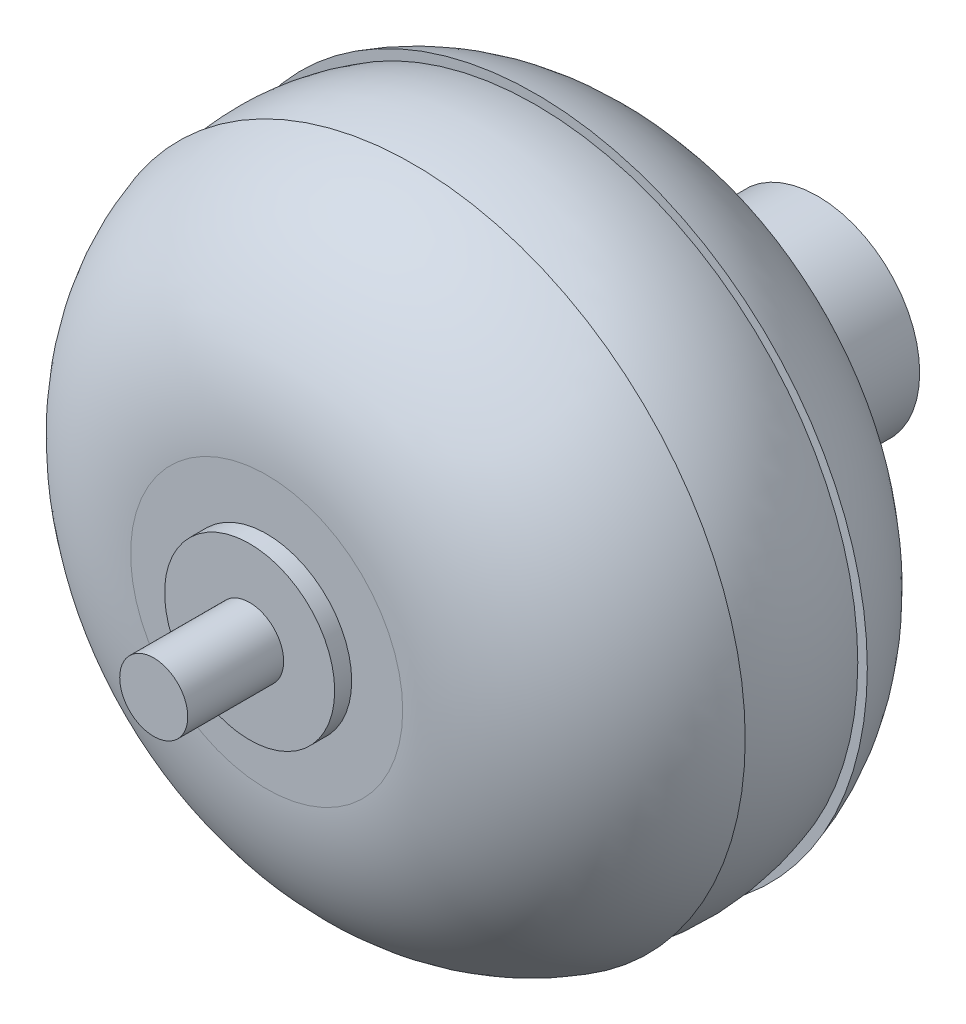
ISO-10303-21;
HEADER;
FILE_DESCRIPTION(('STEP AP214'),'2;1');
FILE_NAME('part.step','',(''),(''),'','','');
FILE_SCHEMA(('AUTOMOTIVE_DESIGN { 1 0 10303 214 1 1 1 1 }'));
ENDSEC;
DATA;
#1=APPLICATION_CONTEXT('core data for automotive mechanical design processes');
#2=APPLICATION_PROTOCOL_DEFINITION('international standard','automotive_design',2000,#1);
#3=PRODUCT_CONTEXT('',#1,'mechanical');
#4=PRODUCT('Part','Part','',(#3));
#5=PRODUCT_RELATED_PRODUCT_CATEGORY('part','',(#4));
#6=PRODUCT_DEFINITION_FORMATION('','',#4);
#7=PRODUCT_DEFINITION_CONTEXT('part definition',#1,'design');
#8=PRODUCT_DEFINITION('design','',#6,#7);
#9=PRODUCT_DEFINITION_SHAPE('','',#8);
#10=(LENGTH_UNIT() NAMED_UNIT(*) SI_UNIT(.MILLI.,.METRE.));
#11=(NAMED_UNIT(*) PLANE_ANGLE_UNIT() SI_UNIT($,.RADIAN.));
#12=(NAMED_UNIT(*) SI_UNIT($,.STERADIAN.) SOLID_ANGLE_UNIT());
#13=UNCERTAINTY_MEASURE_WITH_UNIT(LENGTH_MEASURE(1.E-05),#10,'distance_accuracy_value','');
#14=(GEOMETRIC_REPRESENTATION_CONTEXT(3) GLOBAL_UNCERTAINTY_ASSIGNED_CONTEXT((#13)) GLOBAL_UNIT_ASSIGNED_CONTEXT((#10,
#11,#12)) REPRESENTATION_CONTEXT('',''));
#15=CARTESIAN_POINT('',(0.,0.,0.));
#16=DIRECTION('',(0.,0.,1.));
#17=DIRECTION('',(1.,0.,0.));
#18=AXIS2_PLACEMENT_3D('',#15,#16,#17);
#19=CARTESIAN_POINT('',(0.,0.,6.2));
#20=DIRECTION('',(0.,0.,1.));
#21=DIRECTION('',(1.,0.,0.));
#22=AXIS2_PLACEMENT_3D('',#19,#20,#21);
#23=DEGENERATE_TOROIDAL_SURFACE('',#22,4.,6.,.T.);
#24=CARTESIAN_POINT('',(0.,0.,12.2));
#25=DIRECTION('',(0.,0.,1.));
#26=DIRECTION('',(1.,0.,0.));
#27=AXIS2_PLACEMENT_3D('',#24,#25,#26);
#28=CIRCLE('',#27,4.);
#29=CARTESIAN_POINT('',(4.,0.,12.2));
#30=VERTEX_POINT('',#29);
#31=EDGE_CURVE('E55',#30,#30,#28,.T.);
#32=ORIENTED_EDGE('',*,*,#31,.F.);
#33=EDGE_LOOP('',(#32));
#34=FACE_BOUND('',#33,.T.);
#35=CARTESIAN_POINT('',(0.,0.,7.88726295495752));
#36=DIRECTION('',(0.,0.,-1.));
#37=DIRECTION('',(-1.,0.,0.));
#38=AXIS2_PLACEMENT_3D('',#35,#36,#37);
#39=CIRCLE('',#38,9.75787666773334);
#40=CARTESIAN_POINT('',(-9.75787666773334,0.,7.88726295495752));
#41=VERTEX_POINT('',#40);
#42=EDGE_CURVE('E43',#41,#41,#39,.F.);
#43=ORIENTED_EDGE('',*,*,#42,.T.);
#44=EDGE_LOOP('',(#43));
#45=FACE_BOUND('',#44,.T.);
#46=ADVANCED_FACE('F39',(#34,#45),#23,.T.);
#47=CARTESIAN_POINT('',(0.,0.,12.2));
#48=DIRECTION('',(0.,0.,1.));
#49=DIRECTION('',(1.,0.,0.));
#50=AXIS2_PLACEMENT_3D('',#47,#48,#49);
#51=PLANE('',#50);
#52=ORIENTED_EDGE('',*,*,#31,.T.);
#53=EDGE_LOOP('',(#52));
#54=FACE_BOUND('',#53,.T.);
#55=CARTESIAN_POINT('',(0.,0.,12.2));
#56=DIRECTION('',(0.,0.,1.));
#57=DIRECTION('',(1.,0.,0.));
#58=AXIS2_PLACEMENT_3D('',#55,#56,#57);
#59=CIRCLE('',#58,2.5);
#60=CARTESIAN_POINT('',(2.5,0.,12.2));
#61=VERTEX_POINT('',#60);
#62=EDGE_CURVE('E96',#61,#61,#59,.T.);
#63=ORIENTED_EDGE('',*,*,#62,.F.);
#64=EDGE_LOOP('',(#63));
#65=FACE_BOUND('',#64,.T.);
#66=ADVANCED_FACE('F106',(#54,#65),#51,.T.);
#67=CARTESIAN_POINT('',(0.,0.,12.7));
#68=DIRECTION('',(0.,0.,-1.));
#69=DIRECTION('',(-1.,0.,0.));
#70=AXIS2_PLACEMENT_3D('',#67,#68,#69);
#71=CYLINDRICAL_SURFACE('',#70,2.5);
#72=CARTESIAN_POINT('',(0.,0.,12.7));
#73=DIRECTION('',(0.,0.,1.));
#74=DIRECTION('',(1.,0.,0.));
#75=AXIS2_PLACEMENT_3D('',#72,#73,#74);
#76=CIRCLE('',#75,2.5);
#77=CARTESIAN_POINT('',(2.5,0.,12.7));
#78=VERTEX_POINT('',#77);
#79=EDGE_CURVE('E93',#78,#78,#76,.T.);
#80=ORIENTED_EDGE('',*,*,#79,.F.);
#81=EDGE_LOOP('',(#80));
#82=FACE_BOUND('',#81,.T.);
#83=ORIENTED_EDGE('',*,*,#62,.T.);
#84=EDGE_LOOP('',(#83));
#85=FACE_BOUND('',#84,.T.);
#86=ADVANCED_FACE('F157',(#82,#85),#71,.T.);
#87=CARTESIAN_POINT('',(0.,0.,12.7));
#88=DIRECTION('',(0.,0.,1.));
#89=DIRECTION('',(1.,0.,0.));
#90=AXIS2_PLACEMENT_3D('',#87,#88,#89);
#91=PLANE('',#90);
#92=CARTESIAN_POINT('',(0.,0.,12.7));
#93=DIRECTION('',(0.,0.,1.));
#94=DIRECTION('',(1.,0.,0.));
#95=AXIS2_PLACEMENT_3D('',#92,#93,#94);
#96=CIRCLE('',#95,1.);
#97=CARTESIAN_POINT('',(-1.,0.,12.7));
#98=VERTEX_POINT('',#97);
#99=EDGE_CURVE('E92',#98,#98,#96,.F.);
#100=ORIENTED_EDGE('',*,*,#99,.T.);
#101=EDGE_LOOP('',(#100));
#102=FACE_BOUND('',#101,.T.);
#103=ORIENTED_EDGE('',*,*,#79,.T.);
#104=EDGE_LOOP('',(#103));
#105=FACE_BOUND('',#104,.T.);
#106=ADVANCED_FACE('F153',(#102,#105),#91,.T.);
#107=CARTESIAN_POINT('',(0.,0.,15.52));
#108=DIRECTION('',(0.,0.,-1.));
#109=DIRECTION('',(-1.,0.,0.));
#110=AXIS2_PLACEMENT_3D('',#107,#108,#109);
#111=CYLINDRICAL_SURFACE('',#110,1.);
#112=CARTESIAN_POINT('',(0.,0.,15.52));
#113=DIRECTION('',(0.,0.,1.));
#114=DIRECTION('',(1.,0.,0.));
#115=AXIS2_PLACEMENT_3D('',#112,#113,#114);
#116=CIRCLE('',#115,1.);
#117=CARTESIAN_POINT('',(-1.,0.,15.52));
#118=VERTEX_POINT('',#117);
#119=EDGE_CURVE('E89',#118,#118,#116,.T.);
#120=CARTESIAN_POINT('',(-1.,0.,12.7));
#121=CARTESIAN_POINT('',(-1.,0.,12.729375));
#122=CARTESIAN_POINT('',(-1.,0.,12.75875));
#123=CARTESIAN_POINT('',(-1.,0.,12.8175));
#124=CARTESIAN_POINT('',(-1.,0.,12.846875));
#125=CARTESIAN_POINT('',(-1.,0.,12.905625));
#126=CARTESIAN_POINT('',(-1.,0.,12.935));
#127=CARTESIAN_POINT('',(-1.,0.,12.99375));
#128=CARTESIAN_POINT('',(-1.,0.,13.023125));
#129=CARTESIAN_POINT('',(-1.,0.,13.081875));
#130=CARTESIAN_POINT('',(-1.,0.,13.11125));
#131=CARTESIAN_POINT('',(-1.,0.,13.17));
#132=CARTESIAN_POINT('',(-1.,0.,13.199375));
#133=CARTESIAN_POINT('',(-1.,0.,13.258125));
#134=CARTESIAN_POINT('',(-1.,0.,13.2875));
#135=CARTESIAN_POINT('',(-1.,0.,13.34625));
#136=CARTESIAN_POINT('',(-1.,0.,13.375625));
#137=CARTESIAN_POINT('',(-1.,0.,13.434375));
#138=CARTESIAN_POINT('',(-1.,0.,13.46375));
#139=CARTESIAN_POINT('',(-1.,0.,13.5225));
#140=CARTESIAN_POINT('',(-1.,0.,13.551875));
#141=CARTESIAN_POINT('',(-1.,0.,13.610625));
#142=CARTESIAN_POINT('',(-1.,0.,13.64));
#143=CARTESIAN_POINT('',(-1.,0.,13.69875));
#144=CARTESIAN_POINT('',(-1.,0.,13.728125));
#145=CARTESIAN_POINT('',(-1.,0.,13.786875));
#146=CARTESIAN_POINT('',(-1.,0.,13.81625));
#147=CARTESIAN_POINT('',(-1.,0.,13.875));
#148=CARTESIAN_POINT('',(-1.,0.,13.904375));
#149=CARTESIAN_POINT('',(-1.,0.,13.963125));
#150=CARTESIAN_POINT('',(-1.,0.,13.9925));
#151=CARTESIAN_POINT('',(-1.,0.,14.05125));
#152=CARTESIAN_POINT('',(-1.,0.,14.080625));
#153=CARTESIAN_POINT('',(-1.,0.,14.139375));
#154=CARTESIAN_POINT('',(-1.,0.,14.16875));
#155=CARTESIAN_POINT('',(-1.,0.,14.2275));
#156=CARTESIAN_POINT('',(-1.,0.,14.256875));
#157=CARTESIAN_POINT('',(-1.,0.,14.315625));
#158=CARTESIAN_POINT('',(-1.,0.,14.345));
#159=CARTESIAN_POINT('',(-1.,0.,14.40375));
#160=CARTESIAN_POINT('',(-1.,0.,14.433125));
#161=CARTESIAN_POINT('',(-1.,0.,14.491875));
#162=CARTESIAN_POINT('',(-1.,0.,14.52125));
#163=CARTESIAN_POINT('',(-1.,0.,14.58));
#164=CARTESIAN_POINT('',(-1.,0.,14.609375));
#165=CARTESIAN_POINT('',(-1.,0.,14.668125));
#166=CARTESIAN_POINT('',(-1.,0.,14.6975));
#167=CARTESIAN_POINT('',(-1.,0.,14.75625));
#168=CARTESIAN_POINT('',(-1.,0.,14.785625));
#169=CARTESIAN_POINT('',(-1.,0.,14.844375));
#170=CARTESIAN_POINT('',(-1.,0.,14.87375));
#171=CARTESIAN_POINT('',(-1.,0.,14.9325));
#172=CARTESIAN_POINT('',(-1.,0.,14.961875));
#173=CARTESIAN_POINT('',(-1.,0.,15.020625));
#174=CARTESIAN_POINT('',(-1.,0.,15.05));
#175=CARTESIAN_POINT('',(-1.,0.,15.10875));
#176=CARTESIAN_POINT('',(-1.,0.,15.138125));
#177=CARTESIAN_POINT('',(-1.,0.,15.196875));
#178=CARTESIAN_POINT('',(-1.,0.,15.22625));
#179=CARTESIAN_POINT('',(-1.,0.,15.285));
#180=CARTESIAN_POINT('',(-1.,0.,15.314375));
#181=CARTESIAN_POINT('',(-1.,0.,15.373125));
#182=CARTESIAN_POINT('',(-1.,0.,15.4025));
#183=CARTESIAN_POINT('',(-1.,0.,15.46125));
#184=CARTESIAN_POINT('',(-1.,0.,15.490625));
#185=CARTESIAN_POINT('',(-1.,0.,15.52));
#186=B_SPLINE_CURVE_WITH_KNOTS('',3,(#120,#121,#122,#123,#124,#125,#126,#127,#128,#129,#130,
#131,#132,#133,#134,#135,#136,#137,#138,#139,#140,#141,#142,#143,#144,#145,#146,#147,#148,#149,
#150,#151,#152,#153,#154,#155,#156,#157,#158,#159,#160,#161,#162,#163,#164,#165,#166,#167,#168,
#169,#170,#171,#172,#173,#174,#175,#176,#177,#178,#179,#180,#181,#182,#183,#184,#185),
.UNSPECIFIED.,.F.,.F.,(4,2,2,2,2,2,2,2,2,2,2,2,2,2,2,2,2,2,2,2,2,2,2,2,2,2,2,2,2,2,2,2,4),(0.,
0.0881249999999997,0.176250000000001,0.264375000000001,0.3525,0.440625,0.52875,
0.616875000000001,0.705000000000001,0.793125,0.88125,0.969375,1.0575,1.145625,1.23375,1.321875,
1.41,1.498125,1.58625,1.674375,1.7625,1.850625,1.93875,2.026875,2.115,2.203125,2.29125,2.379375,
2.4675,2.555625,2.64375,2.731875,2.82),.UNSPECIFIED.);
#187=EDGE_CURVE('BSEAM149',#98,#118,#186,.T.);
#188=ORIENTED_EDGE('',*,*,#99,.F.);
#189=ORIENTED_EDGE('',*,*,#119,.F.);
#190=ORIENTED_EDGE('',*,*,#187,.T.);
#191=ORIENTED_EDGE('',*,*,#187,.F.);
#192=EDGE_LOOP('',(#188,#190,#189,#191));
#193=FACE_BOUND('',#192,.T.);
#194=ADVANCED_FACE('F149',(#193),#111,.T.);
#195=CARTESIAN_POINT('',(0.,0.,15.52));
#196=DIRECTION('',(0.,0.,1.));
#197=DIRECTION('',(1.,0.,0.));
#198=AXIS2_PLACEMENT_3D('',#195,#196,#197);
#199=PLANE('',#198);
#200=ORIENTED_EDGE('',*,*,#119,.T.);
#201=EDGE_LOOP('',(#200));
#202=FACE_BOUND('',#201,.T.);
#203=ADVANCED_FACE('F117',(#202),#199,.T.);
#204=CARTESIAN_POINT('',(0.,10.5991008266728,7.88726295495752));
#205=DIRECTION('',(0.,0.,-1.));
#206=DIRECTION('',(-1.,0.,0.));
#207=AXIS2_PLACEMENT_3D('',#204,#205,#206);
#208=PLANE('',#207);
#209=ORIENTED_EDGE('',*,*,#42,.F.);
#210=EDGE_LOOP('',(#209));
#211=FACE_BOUND('',#210,.T.);
#212=CARTESIAN_POINT('',(0.,0.,7.88726295495752));
#213=DIRECTION('',(0.,0.,1.));
#214=DIRECTION('',(1.,0.,0.));
#215=AXIS2_PLACEMENT_3D('',#212,#213,#214);
#216=CIRCLE('',#215,9.47120705648134);
#217=CARTESIAN_POINT('',(9.47120705648134,0.,7.88726295495752));
#218=VERTEX_POINT('',#217);
#219=EDGE_CURVE('E69',#218,#218,#216,.T.);
#220=ORIENTED_EDGE('',*,*,#219,.T.);
#221=EDGE_LOOP('',(#220));
#222=FACE_BOUND('',#221,.T.);
#223=ADVANCED_FACE('F113',(#211,#222),#208,.T.);
#224=CARTESIAN_POINT('',(0.,10.5991008266728,4.29107991956434));
#225=DIRECTION('',(0.,0.,1.));
#226=DIRECTION('',(1.,0.,0.));
#227=AXIS2_PLACEMENT_3D('',#224,#225,#226);
#228=PLANE('',#227);
#229=CARTESIAN_POINT('',(0.,0.,4.29107991956434));
#230=DIRECTION('',(0.,0.,1.));
#231=DIRECTION('',(1.,0.,0.));
#232=AXIS2_PLACEMENT_3D('',#229,#230,#231);
#233=CIRCLE('',#232,9.75148608262976);
#234=CARTESIAN_POINT('',(9.75148608262976,0.,4.29107991956434));
#235=VERTEX_POINT('',#234);
#236=EDGE_CURVE('E58',#235,#235,#233,.F.);
#237=ORIENTED_EDGE('',*,*,#236,.F.);
#238=EDGE_LOOP('',(#237));
#239=FACE_BOUND('',#238,.T.);
#240=CARTESIAN_POINT('',(0.,0.,4.29107991956434));
#241=DIRECTION('',(0.,0.,1.));
#242=DIRECTION('',(1.,0.,0.));
#243=AXIS2_PLACEMENT_3D('',#240,#241,#242);
#244=CIRCLE('',#243,9.47120705648134);
#245=CARTESIAN_POINT('',(9.47120705648134,0.,4.29107991956434));
#246=VERTEX_POINT('',#245);
#247=EDGE_CURVE('E61',#246,#246,#244,.T.);
#248=ORIENTED_EDGE('',*,*,#247,.F.);
#249=EDGE_LOOP('',(#248));
#250=FACE_BOUND('',#249,.T.);
#251=ADVANCED_FACE('F116',(#239,#250),#228,.T.);
#252=CARTESIAN_POINT('',(0.,0.,6.08917143726093));
#253=DIRECTION('',(0.,0.,1.));
#254=DIRECTION('',(1.,0.,0.));
#255=AXIS2_PLACEMENT_3D('',#252,#253,#254);
#256=DEGENERATE_TOROIDAL_SURFACE('',#255,3.97488873425487,5.78296188862203,.T.);
#257=ORIENTED_EDGE('',*,*,#247,.T.);
#258=EDGE_LOOP('',(#257));
#259=FACE_BOUND('',#258,.T.);
#260=ORIENTED_EDGE('',*,*,#219,.F.);
#261=EDGE_LOOP('',(#260));
#262=FACE_BOUND('',#261,.T.);
#263=ADVANCED_FACE('F121',(#259,#262),#256,.T.);
#264=CARTESIAN_POINT('',(0.,0.,-1.5));
#265=DIRECTION('',(0.,0.,-1.));
#266=DIRECTION('',(-1.,0.,0.));
#267=AXIS2_PLACEMENT_3D('',#264,#265,#266);
#268=PLANE('',#267);
#269=CARTESIAN_POINT('',(0.,0.,-1.5));
#270=DIRECTION('',(0.,0.,-1.));
#271=DIRECTION('',(-1.,0.,0.));
#272=AXIS2_PLACEMENT_3D('',#269,#270,#271);
#273=CIRCLE('',#272,2.02);
#274=CARTESIAN_POINT('',(-2.02,0.,-1.5));
#275=VERTEX_POINT('',#274);
#276=EDGE_CURVE('E79',#275,#275,#273,.T.);
#277=ORIENTED_EDGE('',*,*,#276,.T.);
#278=EDGE_LOOP('',(#277));
#279=FACE_BOUND('',#278,.T.);
#280=ADVANCED_FACE('F123',(#279),#268,.T.);
#281=CARTESIAN_POINT('',(0.,0.,-1.5));
#282=DIRECTION('',(0.,0.,-1.));
#283=DIRECTION('',(-1.,0.,0.));
#284=AXIS2_PLACEMENT_3D('',#281,#282,#283);
#285=CYLINDRICAL_SURFACE('',#284,2.02);
#286=ORIENTED_EDGE('',*,*,#276,.F.);
#287=EDGE_LOOP('',(#286));
#288=FACE_BOUND('',#287,.T.);
#289=CARTESIAN_POINT('',(0.,0.,-4.));
#290=DIRECTION('',(0.,0.,-1.));
#291=DIRECTION('',(-1.,0.,0.));
#292=AXIS2_PLACEMENT_3D('',#289,#290,#291);
#293=CIRCLE('',#292,2.02);
#294=CARTESIAN_POINT('',(-2.02,0.,-4.));
#295=VERTEX_POINT('',#294);
#296=EDGE_CURVE('E66',#295,#295,#293,.T.);
#297=ORIENTED_EDGE('',*,*,#296,.T.);
#298=EDGE_LOOP('',(#297));
#299=FACE_BOUND('',#298,.T.);
#300=ADVANCED_FACE('F129',(#288,#299),#285,.F.);
#301=CARTESIAN_POINT('',(0.,0.,-4.));
#302=DIRECTION('',(0.,0.,-1.));
#303=DIRECTION('',(-1.,0.,0.));
#304=AXIS2_PLACEMENT_3D('',#301,#302,#303);
#305=PLANE('',#304);
#306=ORIENTED_EDGE('',*,*,#296,.F.);
#307=EDGE_LOOP('',(#306));
#308=FACE_BOUND('',#307,.T.);
#309=CARTESIAN_POINT('',(0.,0.,-4.));
#310=DIRECTION('',(0.,0.,-1.));
#311=DIRECTION('',(-1.,0.,0.));
#312=AXIS2_PLACEMENT_3D('',#309,#310,#311);
#313=CIRCLE('',#312,3.);
#314=CARTESIAN_POINT('',(-3.,0.,-4.));
#315=VERTEX_POINT('',#314);
#316=EDGE_CURVE('E83',#315,#315,#313,.T.);
#317=ORIENTED_EDGE('',*,*,#316,.T.);
#318=EDGE_LOOP('',(#317));
#319=FACE_BOUND('',#318,.T.);
#320=ADVANCED_FACE('F137',(#308,#319),#305,.T.);
#321=CARTESIAN_POINT('',(0.,0.,-4.));
#322=DIRECTION('',(0.,0.,1.));
#323=DIRECTION('',(1.,0.,0.));
#324=AXIS2_PLACEMENT_3D('',#321,#322,#323);
#325=CYLINDRICAL_SURFACE('',#324,3.);
#326=ORIENTED_EDGE('',*,*,#316,.F.);
#327=EDGE_LOOP('',(#326));
#328=FACE_BOUND('',#327,.T.);
#329=CARTESIAN_POINT('',(0.,0.,0.));
#330=DIRECTION('',(0.,0.,1.));
#331=DIRECTION('',(1.,0.,0.));
#332=AXIS2_PLACEMENT_3D('',#329,#330,#331);
#333=CIRCLE('',#332,3.);
#334=CARTESIAN_POINT('',(3.,0.,0.));
#335=VERTEX_POINT('',#334);
#336=EDGE_CURVE('E10',#335,#335,#333,.F.);
#337=ORIENTED_EDGE('',*,*,#336,.T.);
#338=EDGE_LOOP('',(#337));
#339=FACE_BOUND('',#338,.T.);
#340=ADVANCED_FACE('F141',(#328,#339),#325,.T.);
#341=CARTESIAN_POINT('',(0.,0.,0.));
#342=DIRECTION('',(0.,0.,1.));
#343=DIRECTION('',(1.,0.,0.));
#344=AXIS2_PLACEMENT_3D('',#341,#342,#343);
#345=PLANE('',#344);
#346=ORIENTED_EDGE('',*,*,#336,.F.);
#347=EDGE_LOOP('',(#346));
#348=FACE_BOUND('',#347,.T.);
#349=CARTESIAN_POINT('',(0.,0.,0.));
#350=DIRECTION('',(0.,0.,1.));
#351=DIRECTION('',(1.,0.,0.));
#352=AXIS2_PLACEMENT_3D('',#349,#350,#351);
#353=CIRCLE('',#352,4.);
#354=CARTESIAN_POINT('',(4.,0.,0.));
#355=VERTEX_POINT('',#354);
#356=EDGE_CURVE('E48',#355,#355,#353,.F.);
#357=ORIENTED_EDGE('',*,*,#356,.T.);
#358=EDGE_LOOP('',(#357));
#359=FACE_BOUND('',#358,.T.);
#360=ADVANCED_FACE('F145',(#348,#359),#345,.F.);
#361=CARTESIAN_POINT('',(0.,0.,6.));
#362=DIRECTION('',(0.,0.,1.));
#363=DIRECTION('',(1.,0.,0.));
#364=AXIS2_PLACEMENT_3D('',#361,#362,#363);
#365=DEGENERATE_TOROIDAL_SURFACE('',#364,4.,6.,.T.);
#366=ORIENTED_EDGE('',*,*,#356,.F.);
#367=EDGE_LOOP('',(#366));
#368=FACE_BOUND('',#367,.T.);
#369=ORIENTED_EDGE('',*,*,#236,.T.);
#370=EDGE_LOOP('',(#369));
#371=FACE_BOUND('',#370,.T.);
#372=ADVANCED_FACE('F41',(#368,#371),#365,.T.);
#373=CLOSED_SHELL('',(#46,#66,#86,#106,#194,#203,#223,#251,#263,#280,#300,#320,#340,#360,#372));
#374=MANIFOLD_SOLID_BREP('B2',#373);
#375=ADVANCED_BREP_SHAPE_REPRESENTATION('',(#18,#374),#14);
#376=SHAPE_DEFINITION_REPRESENTATION(#9,#375);
ENDSEC;
END-ISO-10303-21;
